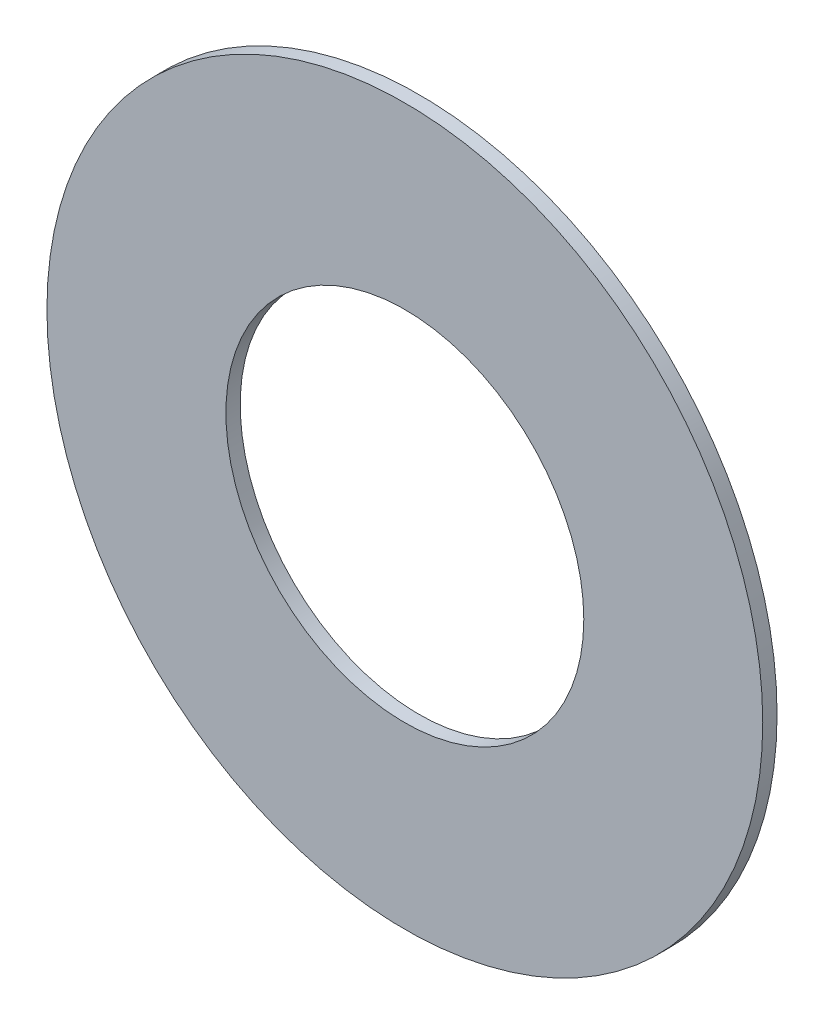
ISO-10303-21;
HEADER;
FILE_DESCRIPTION(('STEP AP214'),'2;1');
FILE_NAME('part.step','',(''),(''),'','','');
FILE_SCHEMA(('AUTOMOTIVE_DESIGN { 1 0 10303 214 1 1 1 1 }'));
ENDSEC;
DATA;
#1=APPLICATION_CONTEXT('core data for automotive mechanical design processes');
#2=APPLICATION_PROTOCOL_DEFINITION('international standard','automotive_design',2000,#1);
#3=PRODUCT_CONTEXT('',#1,'mechanical');
#4=PRODUCT('Part','Part','',(#3));
#5=PRODUCT_RELATED_PRODUCT_CATEGORY('part','',(#4));
#6=PRODUCT_DEFINITION_FORMATION('','',#4);
#7=PRODUCT_DEFINITION_CONTEXT('part definition',#1,'design');
#8=PRODUCT_DEFINITION('design','',#6,#7);
#9=PRODUCT_DEFINITION_SHAPE('','',#8);
#10=(LENGTH_UNIT() NAMED_UNIT(*) SI_UNIT(.MILLI.,.METRE.));
#11=(NAMED_UNIT(*) PLANE_ANGLE_UNIT() SI_UNIT($,.RADIAN.));
#12=(NAMED_UNIT(*) SI_UNIT($,.STERADIAN.) SOLID_ANGLE_UNIT());
#13=UNCERTAINTY_MEASURE_WITH_UNIT(LENGTH_MEASURE(1.E-05),#10,'distance_accuracy_value','');
#14=(GEOMETRIC_REPRESENTATION_CONTEXT(3) GLOBAL_UNCERTAINTY_ASSIGNED_CONTEXT((#13)) GLOBAL_UNIT_ASSIGNED_CONTEXT((#10,
#11,#12)) REPRESENTATION_CONTEXT('',''));
#15=CARTESIAN_POINT('',(0.,0.,0.));
#16=DIRECTION('',(0.,0.,1.));
#17=DIRECTION('',(1.,0.,0.));
#18=AXIS2_PLACEMENT_3D('',#15,#16,#17);
#19=CARTESIAN_POINT('',(0.,0.,2.));
#20=DIRECTION('',(0.,0.,1.));
#21=DIRECTION('',(1.,0.,0.));
#22=AXIS2_PLACEMENT_3D('',#19,#20,#21);
#23=PLANE('',#22);
#24=CARTESIAN_POINT('',(0.,0.,2.));
#25=DIRECTION('',(0.,0.,1.));
#26=DIRECTION('',(1.,0.,0.));
#27=AXIS2_PLACEMENT_3D('',#24,#25,#26);
#28=CIRCLE('',#27,50.);
#29=CARTESIAN_POINT('',(50.,0.,2.));
#30=VERTEX_POINT('',#29);
#31=EDGE_CURVE('E10',#30,#30,#28,.T.);
#32=ORIENTED_EDGE('',*,*,#31,.T.);
#33=EDGE_LOOP('',(#32));
#34=FACE_BOUND('',#33,.T.);
#35=CARTESIAN_POINT('',(0.,0.,2.));
#36=DIRECTION('',(0.,0.,1.));
#37=DIRECTION('',(1.,0.,0.));
#38=AXIS2_PLACEMENT_3D('',#35,#36,#37);
#39=CIRCLE('',#38,25.);
#40=CARTESIAN_POINT('',(25.,0.,2.));
#41=VERTEX_POINT('',#40);
#42=EDGE_CURVE('E49',#41,#41,#39,.T.);
#43=ORIENTED_EDGE('',*,*,#42,.F.);
#44=EDGE_LOOP('',(#43));
#45=FACE_BOUND('',#44,.T.);
#46=ADVANCED_FACE('F39',(#34,#45),#23,.T.);
#47=CARTESIAN_POINT('',(0.,0.,0.));
#48=DIRECTION('',(0.,0.,1.));
#49=DIRECTION('',(1.,0.,0.));
#50=AXIS2_PLACEMENT_3D('',#47,#48,#49);
#51=PLANE('',#50);
#52=CARTESIAN_POINT('',(0.,0.,0.));
#53=DIRECTION('',(0.,0.,1.));
#54=DIRECTION('',(1.,0.,0.));
#55=AXIS2_PLACEMENT_3D('',#52,#53,#54);
#56=CIRCLE('',#55,50.);
#57=CARTESIAN_POINT('',(50.,0.,0.));
#58=VERTEX_POINT('',#57);
#59=EDGE_CURVE('E43',#58,#58,#56,.T.);
#60=ORIENTED_EDGE('',*,*,#59,.F.);
#61=EDGE_LOOP('',(#60));
#62=FACE_BOUND('',#61,.T.);
#63=CARTESIAN_POINT('',(0.,0.,0.));
#64=DIRECTION('',(0.,0.,1.));
#65=DIRECTION('',(1.,0.,0.));
#66=AXIS2_PLACEMENT_3D('',#63,#64,#65);
#67=CIRCLE('',#66,25.);
#68=CARTESIAN_POINT('',(25.,0.,0.));
#69=VERTEX_POINT('',#68);
#70=EDGE_CURVE('E55',#69,#69,#67,.T.);
#71=ORIENTED_EDGE('',*,*,#70,.T.);
#72=EDGE_LOOP('',(#71));
#73=FACE_BOUND('',#72,.T.);
#74=ADVANCED_FACE('F65',(#62,#73),#51,.F.);
#75=CARTESIAN_POINT('',(0.,0.,2.));
#76=DIRECTION('',(0.,0.,-1.));
#77=DIRECTION('',(-1.,0.,0.));
#78=AXIS2_PLACEMENT_3D('',#75,#76,#77);
#79=CYLINDRICAL_SURFACE('',#78,50.);
#80=ORIENTED_EDGE('',*,*,#31,.F.);
#81=EDGE_LOOP('',(#80));
#82=FACE_BOUND('',#81,.T.);
#83=ORIENTED_EDGE('',*,*,#59,.T.);
#84=EDGE_LOOP('',(#83));
#85=FACE_BOUND('',#84,.T.);
#86=ADVANCED_FACE('F41',(#82,#85),#79,.T.);
#87=CARTESIAN_POINT('',(0.,0.,2.));
#88=DIRECTION('',(0.,0.,-1.));
#89=DIRECTION('',(-1.,0.,0.));
#90=AXIS2_PLACEMENT_3D('',#87,#88,#89);
#91=CYLINDRICAL_SURFACE('',#90,25.);
#92=ORIENTED_EDGE('',*,*,#42,.T.);
#93=EDGE_LOOP('',(#92));
#94=FACE_BOUND('',#93,.T.);
#95=ORIENTED_EDGE('',*,*,#70,.F.);
#96=EDGE_LOOP('',(#95));
#97=FACE_BOUND('',#96,.T.);
#98=ADVANCED_FACE('F59',(#94,#97),#91,.F.);
#99=CLOSED_SHELL('',(#46,#74,#86,#98));
#100=MANIFOLD_SOLID_BREP('B2',#99);
#101=ADVANCED_BREP_SHAPE_REPRESENTATION('',(#18,#100),#14);
#102=SHAPE_DEFINITION_REPRESENTATION(#9,#101);
ENDSEC;
END-ISO-10303-21;
